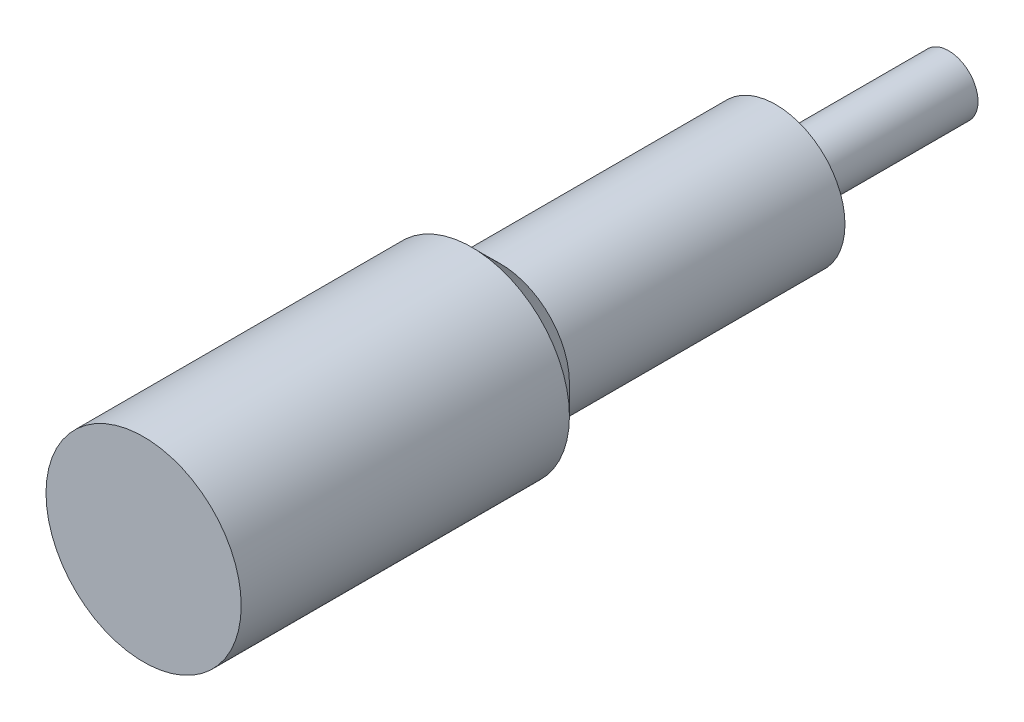
ISO-10303-21;
HEADER;
FILE_DESCRIPTION(('STEP AP214'),'2;1');
FILE_NAME('part.step','',(''),(''),'','','');
FILE_SCHEMA(('AUTOMOTIVE_DESIGN { 1 0 10303 214 1 1 1 1 }'));
ENDSEC;
DATA;
#1=APPLICATION_CONTEXT('core data for automotive mechanical design processes');
#2=APPLICATION_PROTOCOL_DEFINITION('international standard','automotive_design',2000,#1);
#3=PRODUCT_CONTEXT('',#1,'mechanical');
#4=PRODUCT('Part','Part','',(#3));
#5=PRODUCT_RELATED_PRODUCT_CATEGORY('part','',(#4));
#6=PRODUCT_DEFINITION_FORMATION('','',#4);
#7=PRODUCT_DEFINITION_CONTEXT('part definition',#1,'design');
#8=PRODUCT_DEFINITION('design','',#6,#7);
#9=PRODUCT_DEFINITION_SHAPE('','',#8);
#10=(LENGTH_UNIT() NAMED_UNIT(*) SI_UNIT(.MILLI.,.METRE.));
#11=(NAMED_UNIT(*) PLANE_ANGLE_UNIT() SI_UNIT($,.RADIAN.));
#12=(NAMED_UNIT(*) SI_UNIT($,.STERADIAN.) SOLID_ANGLE_UNIT());
#13=UNCERTAINTY_MEASURE_WITH_UNIT(LENGTH_MEASURE(1.E-05),#10,'distance_accuracy_value','');
#14=(GEOMETRIC_REPRESENTATION_CONTEXT(3) GLOBAL_UNCERTAINTY_ASSIGNED_CONTEXT((#13)) GLOBAL_UNIT_ASSIGNED_CONTEXT((#10,
#11,#12)) REPRESENTATION_CONTEXT('',''));
#15=CARTESIAN_POINT('',(0.,0.,0.));
#16=DIRECTION('',(0.,0.,1.));
#17=DIRECTION('',(1.,0.,0.));
#18=AXIS2_PLACEMENT_3D('',#15,#16,#17);
#19=CARTESIAN_POINT('',(0.,0.,23.3));
#20=DIRECTION('',(0.,0.,-1.));
#21=DIRECTION('',(-1.,0.,0.));
#22=AXIS2_PLACEMENT_3D('',#19,#20,#21);
#23=PLANE('',#22);
#24=CARTESIAN_POINT('',(0.,0.,23.3));
#25=DIRECTION('',(0.,0.,1.));
#26=DIRECTION('',(1.,0.,0.));
#27=AXIS2_PLACEMENT_3D('',#24,#25,#26);
#28=CIRCLE('',#27,5.65);
#29=CARTESIAN_POINT('',(5.65,0.,23.3));
#30=VERTEX_POINT('',#29);
#31=EDGE_CURVE('E10',#30,#30,#28,.T.);
#32=ORIENTED_EDGE('',*,*,#31,.T.);
#33=EDGE_LOOP('',(#32));
#34=FACE_BOUND('',#33,.T.);
#35=ADVANCED_FACE('F37',(#34),#23,.F.);
#36=CARTESIAN_POINT('',(0.,0.,15.0443786982249));
#37=DIRECTION('',(0.,0.,1.));
#38=DIRECTION('',(1.,0.,0.));
#39=AXIS2_PLACEMENT_3D('',#36,#37,#38);
#40=CYLINDRICAL_SURFACE('',#39,5.65);
#41=ORIENTED_EDGE('',*,*,#31,.F.);
#42=EDGE_LOOP('',(#41));
#43=FACE_BOUND('',#42,.T.);
#44=CARTESIAN_POINT('',(0.,0.,4.3));
#45=DIRECTION('',(0.,0.,1.));
#46=DIRECTION('',(1.,0.,0.));
#47=AXIS2_PLACEMENT_3D('',#44,#45,#46);
#48=CIRCLE('',#47,5.65);
#49=CARTESIAN_POINT('',(5.65,0.,4.3));
#50=VERTEX_POINT('',#49);
#51=EDGE_CURVE('E44',#50,#50,#48,.T.);
#52=ORIENTED_EDGE('',*,*,#51,.T.);
#53=EDGE_LOOP('',(#52));
#54=FACE_BOUND('',#53,.T.);
#55=ADVANCED_FACE('F81',(#43,#54),#40,.T.);
#56=CARTESIAN_POINT('',(0.,0.,2.65));
#57=DIRECTION('',(0.,0.,1.));
#58=DIRECTION('',(1.,0.,0.));
#59=AXIS2_PLACEMENT_3D('',#56,#57,#58);
#60=CONICAL_SURFACE('',#59,4.,0.785398163397449);
#61=ORIENTED_EDGE('',*,*,#51,.F.);
#62=EDGE_LOOP('',(#61));
#63=FACE_BOUND('',#62,.T.);
#64=CARTESIAN_POINT('',(0.,0.,2.65));
#65=DIRECTION('',(0.,0.,1.));
#66=DIRECTION('',(1.,0.,0.));
#67=AXIS2_PLACEMENT_3D('',#64,#65,#66);
#68=CIRCLE('',#67,4.);
#69=CARTESIAN_POINT('',(4.,0.,2.65));
#70=VERTEX_POINT('',#69);
#71=EDGE_CURVE('E49',#70,#70,#68,.T.);
#72=ORIENTED_EDGE('',*,*,#71,.T.);
#73=EDGE_LOOP('',(#72));
#74=FACE_BOUND('',#73,.T.);
#75=ADVANCED_FACE('F85',(#63,#74),#60,.T.);
#76=CARTESIAN_POINT('',(0.,0.,15.0443786982249));
#77=DIRECTION('',(0.,0.,1.));
#78=DIRECTION('',(1.,0.,0.));
#79=AXIS2_PLACEMENT_3D('',#76,#77,#78);
#80=CYLINDRICAL_SURFACE('',#79,4.);
#81=ORIENTED_EDGE('',*,*,#71,.F.);
#82=EDGE_LOOP('',(#81));
#83=FACE_BOUND('',#82,.T.);
#84=CARTESIAN_POINT('',(0.,0.,-13.3));
#85=DIRECTION('',(0.,0.,1.));
#86=DIRECTION('',(1.,0.,0.));
#87=AXIS2_PLACEMENT_3D('',#84,#85,#86);
#88=CIRCLE('',#87,4.);
#89=CARTESIAN_POINT('',(4.,0.,-13.3));
#90=VERTEX_POINT('',#89);
#91=EDGE_CURVE('E54',#90,#90,#88,.T.);
#92=ORIENTED_EDGE('',*,*,#91,.T.);
#93=EDGE_LOOP('',(#92));
#94=FACE_BOUND('',#93,.T.);
#95=ADVANCED_FACE('F90',(#83,#94),#80,.T.);
#96=CARTESIAN_POINT('',(0.,4.,-13.3));
#97=DIRECTION('',(0.,0.,1.));
#98=DIRECTION('',(1.,0.,0.));
#99=AXIS2_PLACEMENT_3D('',#96,#97,#98);
#100=PLANE('',#99);
#101=ORIENTED_EDGE('',*,*,#91,.F.);
#102=EDGE_LOOP('',(#101));
#103=FACE_BOUND('',#102,.T.);
#104=CARTESIAN_POINT('',(0.,0.,-13.3));
#105=DIRECTION('',(0.,0.,1.));
#106=DIRECTION('',(1.,0.,0.));
#107=AXIS2_PLACEMENT_3D('',#104,#105,#106);
#108=CIRCLE('',#107,1.7);
#109=CARTESIAN_POINT('',(1.7,0.,-13.3));
#110=VERTEX_POINT('',#109);
#111=EDGE_CURVE('E60',#110,#110,#108,.T.);
#112=ORIENTED_EDGE('',*,*,#111,.T.);
#113=EDGE_LOOP('',(#112));
#114=FACE_BOUND('',#113,.T.);
#115=ADVANCED_FACE('F77',(#103,#114),#100,.F.);
#116=CARTESIAN_POINT('',(0.,0.,15.0443786982249));
#117=DIRECTION('',(0.,0.,1.));
#118=DIRECTION('',(1.,0.,0.));
#119=AXIS2_PLACEMENT_3D('',#116,#117,#118);
#120=CYLINDRICAL_SURFACE('',#119,1.7);
#121=ORIENTED_EDGE('',*,*,#111,.F.);
#122=EDGE_LOOP('',(#121));
#123=FACE_BOUND('',#122,.T.);
#124=CARTESIAN_POINT('',(0.,0.,-23.3));
#125=DIRECTION('',(0.,0.,1.));
#126=DIRECTION('',(1.,0.,0.));
#127=AXIS2_PLACEMENT_3D('',#124,#125,#126);
#128=CIRCLE('',#127,1.7);
#129=CARTESIAN_POINT('',(1.7,0.,-23.3));
#130=VERTEX_POINT('',#129);
#131=EDGE_CURVE('E64',#130,#130,#128,.T.);
#132=ORIENTED_EDGE('',*,*,#131,.T.);
#133=EDGE_LOOP('',(#132));
#134=FACE_BOUND('',#133,.T.);
#135=ADVANCED_FACE('F69',(#123,#134),#120,.T.);
#136=CARTESIAN_POINT('',(0.,1.7,-23.3));
#137=DIRECTION('',(0.,0.,1.));
#138=DIRECTION('',(1.,0.,0.));
#139=AXIS2_PLACEMENT_3D('',#136,#137,#138);
#140=PLANE('',#139);
#141=ORIENTED_EDGE('',*,*,#131,.F.);
#142=EDGE_LOOP('',(#141));
#143=FACE_BOUND('',#142,.T.);
#144=ADVANCED_FACE('F71',(#143),#140,.F.);
#145=CLOSED_SHELL('',(#35,#55,#75,#95,#115,#135,#144));
#146=MANIFOLD_SOLID_BREP('B2',#145);
#147=ADVANCED_BREP_SHAPE_REPRESENTATION('',(#18,#146),#14);
#148=SHAPE_DEFINITION_REPRESENTATION(#9,#147);
ENDSEC;
END-ISO-10303-21;
